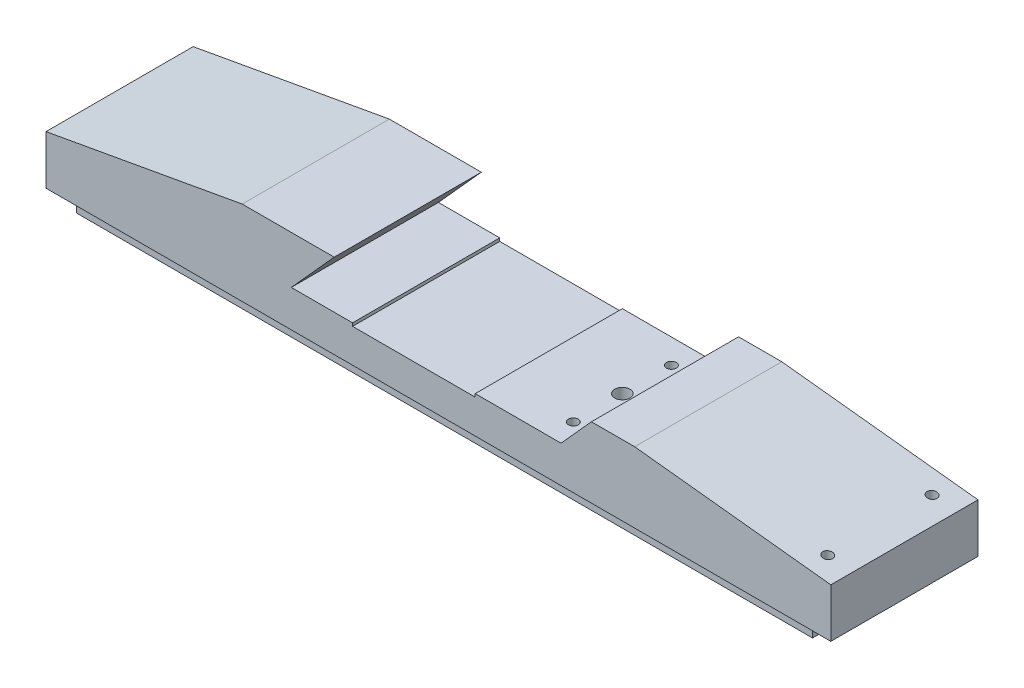
ISO-10303-21;
HEADER;
FILE_DESCRIPTION(('STEP AP214'),'2;1');
FILE_NAME('part.step','',(''),(''),'','','');
FILE_SCHEMA(('AUTOMOTIVE_DESIGN { 1 0 10303 214 1 1 1 1 }'));
ENDSEC;
DATA;
#1=APPLICATION_CONTEXT('core data for automotive mechanical design processes');
#2=APPLICATION_PROTOCOL_DEFINITION('international standard','automotive_design',2000,#1);
#3=PRODUCT_CONTEXT('',#1,'mechanical');
#4=PRODUCT('Part','Part','',(#3));
#5=PRODUCT_RELATED_PRODUCT_CATEGORY('part','',(#4));
#6=PRODUCT_DEFINITION_FORMATION('','',#4);
#7=PRODUCT_DEFINITION_CONTEXT('part definition',#1,'design');
#8=PRODUCT_DEFINITION('design','',#6,#7);
#9=PRODUCT_DEFINITION_SHAPE('','',#8);
#10=(LENGTH_UNIT() NAMED_UNIT(*) SI_UNIT(.MILLI.,.METRE.));
#11=(NAMED_UNIT(*) PLANE_ANGLE_UNIT() SI_UNIT($,.RADIAN.));
#12=(NAMED_UNIT(*) SI_UNIT($,.STERADIAN.) SOLID_ANGLE_UNIT());
#13=UNCERTAINTY_MEASURE_WITH_UNIT(LENGTH_MEASURE(1.E-05),#10,'distance_accuracy_value','');
#14=(GEOMETRIC_REPRESENTATION_CONTEXT(3) GLOBAL_UNCERTAINTY_ASSIGNED_CONTEXT((#13)) GLOBAL_UNIT_ASSIGNED_CONTEXT((#10,
#11,#12)) REPRESENTATION_CONTEXT('',''));
#15=CARTESIAN_POINT('',(0.,0.,0.));
#16=DIRECTION('',(0.,0.,1.));
#17=DIRECTION('',(1.,0.,0.));
#18=AXIS2_PLACEMENT_3D('',#15,#16,#17);
#19=CARTESIAN_POINT('',(406.4,0.,-76.2));
#20=DIRECTION('',(1.,0.,0.));
#21=DIRECTION('',(0.,0.,-1.));
#22=AXIS2_PLACEMENT_3D('',#19,#20,#21);
#23=PLANE('',#22);
#24=DIRECTION('',(0.,0.,1.));
#25=VECTOR('',#24,1.);
#26=CARTESIAN_POINT('',(406.4,19.1516,0.));
#27=LINE('',#26,#25);
#28=CARTESIAN_POINT('',(406.4,19.1516,-25.4381));
#29=VERTEX_POINT('',#28);
#30=CARTESIAN_POINT('',(406.4,19.1516,0.));
#31=VERTEX_POINT('',#30);
#32=EDGE_CURVE('E270',#29,#31,#27,.T.);
#33=ORIENTED_EDGE('',*,*,#32,.F.);
#34=DIRECTION('',(0.,1.,0.));
#35=VECTOR('',#34,1.);
#36=CARTESIAN_POINT('',(406.4,0.,-25.4381));
#37=LINE('',#36,#35);
#38=CARTESIAN_POINT('',(406.4,19.1262,-25.4381));
#39=VERTEX_POINT('',#38);
#40=EDGE_CURVE('E272',#39,#29,#37,.T.);
#41=ORIENTED_EDGE('',*,*,#40,.F.);
#42=DIRECTION('',(0.,0.,1.));
#43=VECTOR('',#42,1.);
#44=CARTESIAN_POINT('',(406.4,19.1262,-76.2));
#45=LINE('',#44,#43);
#46=CARTESIAN_POINT('',(406.4,19.1262,-50.7619));
#47=VERTEX_POINT('',#46);
#48=EDGE_CURVE('E327',#47,#39,#45,.T.);
#49=ORIENTED_EDGE('',*,*,#48,.F.);
#50=DIRECTION('',(0.,1.,0.));
#51=VECTOR('',#50,1.);
#52=CARTESIAN_POINT('',(406.4,0.,-50.7619));
#53=LINE('',#52,#51);
#54=CARTESIAN_POINT('',(406.4,19.1516,-50.7619));
#55=VERTEX_POINT('',#54);
#56=EDGE_CURVE('E76',#47,#55,#53,.T.);
#57=ORIENTED_EDGE('',*,*,#56,.T.);
#58=DIRECTION('',(0.,0.,-1.));
#59=VECTOR('',#58,1.);
#60=CARTESIAN_POINT('',(406.4,19.1516,0.));
#61=LINE('',#60,#59);
#62=CARTESIAN_POINT('',(406.4,19.1516,-76.2));
#63=VERTEX_POINT('',#62);
#64=EDGE_CURVE('E299',#55,#63,#61,.T.);
#65=ORIENTED_EDGE('',*,*,#64,.T.);
#66=DIRECTION('',(0.,1.,0.));
#67=VECTOR('',#66,1.);
#68=CARTESIAN_POINT('',(406.4,0.,-76.2));
#69=LINE('',#68,#67);
#70=CARTESIAN_POINT('',(406.4,44.5262,-76.2));
#71=VERTEX_POINT('',#70);
#72=EDGE_CURVE('E337',#63,#71,#69,.T.);
#73=ORIENTED_EDGE('',*,*,#72,.T.);
#74=DIRECTION('',(0.,0.,1.));
#75=VECTOR('',#74,1.);
#76=CARTESIAN_POINT('',(406.4,44.5262,-76.2));
#77=LINE('',#76,#75);
#78=CARTESIAN_POINT('',(406.4,44.5262,0.));
#79=VERTEX_POINT('',#78);
#80=EDGE_CURVE('E433',#71,#79,#77,.T.);
#81=ORIENTED_EDGE('',*,*,#80,.T.);
#82=DIRECTION('',(0.,1.,0.));
#83=VECTOR('',#82,1.);
#84=CARTESIAN_POINT('',(406.4,0.,0.));
#85=LINE('',#84,#83);
#86=EDGE_CURVE('E376',#31,#79,#85,.T.);
#87=ORIENTED_EDGE('',*,*,#86,.F.);
#88=EDGE_LOOP('',(#33,#41,#49,#57,#65,#73,#81,#87));
#89=FACE_BOUND('',#88,.T.);
#90=ADVANCED_FACE('F52',(#89),#23,.T.);
#91=CARTESIAN_POINT('',(0.,44.5516,-76.2));
#92=DIRECTION('',(-1.,0.,0.));
#93=DIRECTION('',(0.,-1.,0.));
#94=AXIS2_PLACEMENT_3D('',#91,#92,#93);
#95=PLANE('',#94);
#96=DIRECTION('',(0.,0.,1.));
#97=VECTOR('',#96,1.);
#98=CARTESIAN_POINT('',(0.,0.,-76.2));
#99=LINE('',#98,#97);
#100=CARTESIAN_POINT('',(0.,0.,-60.2869));
#101=VERTEX_POINT('',#100);
#102=CARTESIAN_POINT('',(0.,0.,-15.9131));
#103=VERTEX_POINT('',#102);
#104=EDGE_CURVE('E373',#101,#103,#99,.T.);
#105=ORIENTED_EDGE('',*,*,#104,.T.);
#106=DIRECTION('',(0.,1.,0.));
#107=VECTOR('',#106,1.);
#108=CARTESIAN_POINT('',(0.,-1.27859324435232E-13,-15.9131));
#109=LINE('',#108,#107);
#110=CARTESIAN_POINT('',(0.,9.5504,-15.9131));
#111=VERTEX_POINT('',#110);
#112=EDGE_CURVE('E269',#103,#111,#109,.T.);
#113=ORIENTED_EDGE('',*,*,#112,.T.);
#114=DIRECTION('',(0.,0.,-1.));
#115=VECTOR('',#114,1.);
#116=CARTESIAN_POINT('',(0.,9.5504,0.));
#117=LINE('',#116,#115);
#118=CARTESIAN_POINT('',(0.,9.5504,-25.4381));
#119=VERTEX_POINT('',#118);
#120=EDGE_CURVE('E273',#111,#119,#117,.T.);
#121=ORIENTED_EDGE('',*,*,#120,.T.);
#122=DIRECTION('',(0.,1.,0.));
#123=VECTOR('',#122,1.);
#124=CARTESIAN_POINT('',(0.,0.,-25.4381));
#125=LINE('',#124,#123);
#126=CARTESIAN_POINT('',(0.,19.1516,-25.4381));
#127=VERTEX_POINT('',#126);
#128=EDGE_CURVE('E281',#119,#127,#125,.T.);
#129=ORIENTED_EDGE('',*,*,#128,.T.);
#130=DIRECTION('',(0.,0.,1.));
#131=VECTOR('',#130,1.);
#132=CARTESIAN_POINT('',(0.,19.1516,0.));
#133=LINE('',#132,#131);
#134=CARTESIAN_POINT('',(0.,19.1516,0.));
#135=VERTEX_POINT('',#134);
#136=EDGE_CURVE('E278',#127,#135,#133,.T.);
#137=ORIENTED_EDGE('',*,*,#136,.T.);
#138=DIRECTION('',(0.,-1.,0.));
#139=VECTOR('',#138,1.);
#140=CARTESIAN_POINT('',(0.,44.5516,0.));
#141=LINE('',#140,#139);
#142=CARTESIAN_POINT('',(0.,44.5516,0.));
#143=VERTEX_POINT('',#142);
#144=EDGE_CURVE('E332',#143,#135,#141,.T.);
#145=ORIENTED_EDGE('',*,*,#144,.F.);
#146=DIRECTION('',(0.,0.,1.));
#147=VECTOR('',#146,1.);
#148=CARTESIAN_POINT('',(0.,44.5516,-76.2));
#149=LINE('',#148,#147);
#150=CARTESIAN_POINT('',(0.,44.5516,-76.2));
#151=VERTEX_POINT('',#150);
#152=EDGE_CURVE('E410',#151,#143,#149,.T.);
#153=ORIENTED_EDGE('',*,*,#152,.F.);
#154=DIRECTION('',(0.,-1.,0.));
#155=VECTOR('',#154,1.);
#156=CARTESIAN_POINT('',(0.,44.5516,-76.2));
#157=LINE('',#156,#155);
#158=CARTESIAN_POINT('',(0.,19.1516,-76.2));
#159=VERTEX_POINT('',#158);
#160=EDGE_CURVE('E334',#151,#159,#157,.T.);
#161=ORIENTED_EDGE('',*,*,#160,.T.);
#162=DIRECTION('',(0.,0.,-1.));
#163=VECTOR('',#162,1.);
#164=CARTESIAN_POINT('',(0.,19.1516,0.));
#165=LINE('',#164,#163);
#166=CARTESIAN_POINT('',(0.,19.1516,-50.7619));
#167=VERTEX_POINT('',#166);
#168=EDGE_CURVE('E300',#167,#159,#165,.T.);
#169=ORIENTED_EDGE('',*,*,#168,.F.);
#170=DIRECTION('',(0.,1.,0.));
#171=VECTOR('',#170,1.);
#172=CARTESIAN_POINT('',(0.,0.,-50.7619));
#173=LINE('',#172,#171);
#174=CARTESIAN_POINT('',(0.,9.5504,-50.7619));
#175=VERTEX_POINT('',#174);
#176=EDGE_CURVE('E309',#175,#167,#173,.T.);
#177=ORIENTED_EDGE('',*,*,#176,.F.);
#178=DIRECTION('',(0.,0.,1.));
#179=VECTOR('',#178,1.);
#180=CARTESIAN_POINT('',(0.,9.5504,0.));
#181=LINE('',#180,#179);
#182=CARTESIAN_POINT('',(0.,9.5504,-60.2869));
#183=VERTEX_POINT('',#182);
#184=EDGE_CURVE('E306',#183,#175,#181,.T.);
#185=ORIENTED_EDGE('',*,*,#184,.F.);
#186=DIRECTION('',(0.,1.,0.));
#187=VECTOR('',#186,1.);
#188=CARTESIAN_POINT('',(0.,0.,-60.2869));
#189=LINE('',#188,#187);
#190=EDGE_CURVE('E297',#101,#183,#189,.T.);
#191=ORIENTED_EDGE('',*,*,#190,.F.);
#192=EDGE_LOOP('',(#105,#113,#121,#129,#137,#145,#153,#161,#169,#177,#185,#191));
#193=FACE_BOUND('',#192,.T.);
#194=ADVANCED_FACE('F54',(#193),#95,.T.);
#195=CARTESIAN_POINT('',(0.,0.,-76.2));
#196=DIRECTION('',(0.,-1.,0.));
#197=DIRECTION('',(0.,0.,-1.));
#198=AXIS2_PLACEMENT_3D('',#195,#196,#197);
#199=PLANE('',#198);
#200=DIRECTION('',(0.,0.,-1.));
#201=VECTOR('',#200,1.);
#202=CARTESIAN_POINT('',(381.,0.,0.));
#203=LINE('',#202,#201);
#204=CARTESIAN_POINT('',(381.,0.,-15.9131));
#205=VERTEX_POINT('',#204);
#206=CARTESIAN_POINT('',(381.,0.,-60.2869));
#207=VERTEX_POINT('',#206);
#208=EDGE_CURVE('E326',#205,#207,#203,.T.);
#209=ORIENTED_EDGE('',*,*,#208,.F.);
#210=DIRECTION('',(-1.,0.,0.));
#211=VECTOR('',#210,1.);
#212=CARTESIAN_POINT('',(406.4,0.,-15.9131));
#213=LINE('',#212,#211);
#214=EDGE_CURVE('E275',#205,#103,#213,.T.);
#215=ORIENTED_EDGE('',*,*,#214,.T.);
#216=ORIENTED_EDGE('',*,*,#104,.F.);
#217=DIRECTION('',(-1.,0.,0.));
#218=VECTOR('',#217,1.);
#219=CARTESIAN_POINT('',(406.4,0.,-60.2869));
#220=LINE('',#219,#218);
#221=EDGE_CURVE('E303',#207,#101,#220,.T.);
#222=ORIENTED_EDGE('',*,*,#221,.F.);
#223=EDGE_LOOP('',(#209,#215,#216,#222));
#224=FACE_BOUND('',#223,.T.);
#225=ADVANCED_FACE('F476',(#224),#199,.T.);
#226=CARTESIAN_POINT('',(0.,0.,0.));
#227=DIRECTION('',(0.,0.,1.));
#228=DIRECTION('',(1.,0.,0.));
#229=AXIS2_PLACEMENT_3D('',#226,#227,#228);
#230=PLANE('',#229);
#231=ORIENTED_EDGE('',*,*,#144,.T.);
#232=DIRECTION('',(-1.,0.,0.));
#233=VECTOR('',#232,1.);
#234=CARTESIAN_POINT('',(406.4,19.1516,0.));
#235=LINE('',#234,#233);
#236=EDGE_CURVE('E292',#31,#135,#235,.T.);
#237=ORIENTED_EDGE('',*,*,#236,.F.);
#238=ORIENTED_EDGE('',*,*,#86,.T.);
#239=DIRECTION('',(-0.994071691754376,0.108726591285635,0.));
#240=VECTOR('',#239,1.);
#241=CARTESIAN_POINT('',(406.4,44.5262,0.));
#242=LINE('',#241,#240);
#243=CARTESIAN_POINT('',(304.8,55.6387,0.));
#244=VERTEX_POINT('',#243);
#245=EDGE_CURVE('E378',#79,#244,#242,.T.);
#246=ORIENTED_EDGE('',*,*,#245,.T.);
#247=DIRECTION('',(-1.,0.,0.));
#248=VECTOR('',#247,1.);
#249=CARTESIAN_POINT('',(304.8,55.6387,0.));
#250=LINE('',#249,#248);
#251=CARTESIAN_POINT('',(282.423305623551,55.6387,0.));
#252=VERTEX_POINT('',#251);
#253=EDGE_CURVE('E381',#244,#252,#250,.T.);
#254=ORIENTED_EDGE('',*,*,#253,.T.);
#255=DIRECTION('',(-0.669130606358857,-0.743144825477395,0.));
#256=VECTOR('',#255,1.);
#257=CARTESIAN_POINT('',(282.423305623551,55.6387,0.));
#258=LINE('',#257,#256);
#259=CARTESIAN_POINT('',(266.7,38.1762,0.));
#260=VERTEX_POINT('',#259);
#261=EDGE_CURVE('E384',#252,#260,#258,.T.);
#262=ORIENTED_EDGE('',*,*,#261,.T.);
#263=DIRECTION('',(-1.,0.,0.));
#264=VECTOR('',#263,1.);
#265=CARTESIAN_POINT('',(266.7,38.1762,0.));
#266=LINE('',#265,#264);
#267=CARTESIAN_POINT('',(222.25,38.1762,0.));
#268=VERTEX_POINT('',#267);
#269=EDGE_CURVE('E387',#260,#268,#266,.T.);
#270=ORIENTED_EDGE('',*,*,#269,.T.);
#271=DIRECTION('',(0.,-1.,0.));
#272=VECTOR('',#271,1.);
#273=CARTESIAN_POINT('',(222.25,38.1762,0.));
#274=LINE('',#273,#272);
#275=CARTESIAN_POINT('',(222.25,36.5887,0.));
#276=VERTEX_POINT('',#275);
#277=EDGE_CURVE('E390',#268,#276,#274,.T.);
#278=ORIENTED_EDGE('',*,*,#277,.T.);
#279=DIRECTION('',(-1.,0.,0.));
#280=VECTOR('',#279,1.);
#281=CARTESIAN_POINT('',(222.25,36.5887,0.));
#282=LINE('',#281,#280);
#283=CARTESIAN_POINT('',(158.75,36.5887,0.));
#284=VERTEX_POINT('',#283);
#285=EDGE_CURVE('E393',#276,#284,#282,.T.);
#286=ORIENTED_EDGE('',*,*,#285,.T.);
#287=DIRECTION('',(0.,1.,0.));
#288=VECTOR('',#287,1.);
#289=CARTESIAN_POINT('',(158.75,36.5887,0.));
#290=LINE('',#289,#288);
#291=CARTESIAN_POINT('',(158.75,38.1762,0.));
#292=VERTEX_POINT('',#291);
#293=EDGE_CURVE('E396',#284,#292,#290,.T.);
#294=ORIENTED_EDGE('',*,*,#293,.T.);
#295=DIRECTION('',(-1.,0.,0.));
#296=VECTOR('',#295,1.);
#297=CARTESIAN_POINT('',(158.75,38.1762,0.));
#298=LINE('',#297,#296);
#299=CARTESIAN_POINT('',(127.,38.1762,0.));
#300=VERTEX_POINT('',#299);
#301=EDGE_CURVE('E399',#292,#300,#298,.T.);
#302=ORIENTED_EDGE('',*,*,#301,.T.);
#303=DIRECTION('',(0.669130606358862,0.743144825477391,0.));
#304=VECTOR('',#303,1.);
#305=CARTESIAN_POINT('',(127.,38.1762,0.));
#306=LINE('',#305,#304);
#307=CARTESIAN_POINT('',(149.225,62.8595631420786,0.));
#308=VERTEX_POINT('',#307);
#309=EDGE_CURVE('E402',#300,#308,#306,.T.);
#310=ORIENTED_EDGE('',*,*,#309,.T.);
#311=DIRECTION('',(-1.,0.,0.));
#312=VECTOR('',#311,1.);
#313=CARTESIAN_POINT('',(149.225,62.8595631420786,0.));
#314=LINE('',#313,#312);
#315=CARTESIAN_POINT('',(101.6,62.8595631420785,0.));
#316=VERTEX_POINT('',#315);
#317=EDGE_CURVE('E405',#308,#316,#314,.T.);
#318=ORIENTED_EDGE('',*,*,#317,.T.);
#319=DIRECTION('',(-0.984149591332616,-0.177340299649697,0.));
#320=VECTOR('',#319,1.);
#321=CARTESIAN_POINT('',(101.6,62.8595631420785,0.));
#322=LINE('',#321,#320);
#323=EDGE_CURVE('E338',#316,#143,#322,.T.);
#324=ORIENTED_EDGE('',*,*,#323,.T.);
#325=EDGE_LOOP('',(#231,#237,#238,#246,#254,#262,#270,#278,#286,#294,#302,#310,#318,#324));
#326=FACE_BOUND('',#325,.T.);
#327=ADVANCED_FACE('F494',(#326),#230,.T.);
#328=CARTESIAN_POINT('',(381.,19.1262,0.));
#329=DIRECTION('',(-1.,0.,0.));
#330=DIRECTION('',(0.,0.,1.));
#331=AXIS2_PLACEMENT_3D('',#328,#329,#330);
#332=PLANE('',#331);
#333=DIRECTION('',(0.,1.,0.));
#334=VECTOR('',#333,1.);
#335=CARTESIAN_POINT('',(381.,19.1261999999999,-15.9131000000002));
#336=LINE('',#335,#334);
#337=CARTESIAN_POINT('',(381.,9.55040000000001,-15.9131));
#338=VERTEX_POINT('',#337);
#339=EDGE_CURVE('E13',#205,#338,#336,.T.);
#340=ORIENTED_EDGE('',*,*,#339,.F.);
#341=ORIENTED_EDGE('',*,*,#208,.T.);
#342=DIRECTION('',(0.,1.,0.));
#343=VECTOR('',#342,1.);
#344=CARTESIAN_POINT('',(381.,19.1262,-60.2869));
#345=LINE('',#344,#343);
#346=CARTESIAN_POINT('',(381.,9.55040000000001,-60.2869));
#347=VERTEX_POINT('',#346);
#348=EDGE_CURVE('E439',#207,#347,#345,.T.);
#349=ORIENTED_EDGE('',*,*,#348,.T.);
#350=DIRECTION('',(0.,0.,1.));
#351=VECTOR('',#350,1.);
#352=CARTESIAN_POINT('',(381.,9.55040000000001,0.));
#353=LINE('',#352,#351);
#354=CARTESIAN_POINT('',(381.,9.55040000000001,-50.7619));
#355=VERTEX_POINT('',#354);
#356=EDGE_CURVE('E442',#347,#355,#353,.T.);
#357=ORIENTED_EDGE('',*,*,#356,.T.);
#358=DIRECTION('',(0.,1.,0.));
#359=VECTOR('',#358,1.);
#360=CARTESIAN_POINT('',(381.,19.1262,-50.7619));
#361=LINE('',#360,#359);
#362=CARTESIAN_POINT('',(381.,19.1262,-50.7619));
#363=VERTEX_POINT('',#362);
#364=EDGE_CURVE('E316',#355,#363,#361,.T.);
#365=ORIENTED_EDGE('',*,*,#364,.T.);
#366=DIRECTION('',(0.,0.,-1.));
#367=VECTOR('',#366,1.);
#368=CARTESIAN_POINT('',(381.,19.1262,0.));
#369=LINE('',#368,#367);
#370=CARTESIAN_POINT('',(381.,19.1262,-25.4381));
#371=VERTEX_POINT('',#370);
#372=EDGE_CURVE('E330',#371,#363,#369,.T.);
#373=ORIENTED_EDGE('',*,*,#372,.F.);
#374=DIRECTION('',(0.,1.,0.));
#375=VECTOR('',#374,1.);
#376=CARTESIAN_POINT('',(381.,19.1262,-25.4381));
#377=LINE('',#376,#375);
#378=CARTESIAN_POINT('',(381.,9.55040000000001,-25.4381));
#379=VERTEX_POINT('',#378);
#380=EDGE_CURVE('E68',#379,#371,#377,.T.);
#381=ORIENTED_EDGE('',*,*,#380,.F.);
#382=DIRECTION('',(0.,0.,-1.));
#383=VECTOR('',#382,1.);
#384=CARTESIAN_POINT('',(381.,9.55040000000001,0.));
#385=LINE('',#384,#383);
#386=EDGE_CURVE('E61',#338,#379,#385,.T.);
#387=ORIENTED_EDGE('',*,*,#386,.F.);
#388=EDGE_LOOP('',(#340,#341,#349,#357,#365,#373,#381,#387));
#389=FACE_BOUND('',#388,.T.);
#390=ADVANCED_FACE('F457',(#389),#332,.F.);
#391=CARTESIAN_POINT('',(0.,19.1262,0.));
#392=DIRECTION('',(0.,-1.,0.));
#393=DIRECTION('',(0.,0.,-1.));
#394=AXIS2_PLACEMENT_3D('',#391,#392,#393);
#395=PLANE('',#394);
#396=ORIENTED_EDGE('',*,*,#48,.T.);
#397=DIRECTION('',(-1.,0.,0.));
#398=VECTOR('',#397,1.);
#399=CARTESIAN_POINT('',(0.,19.1262,-25.4381));
#400=LINE('',#399,#398);
#401=EDGE_CURVE('E445',#39,#371,#400,.T.);
#402=ORIENTED_EDGE('',*,*,#401,.T.);
#403=ORIENTED_EDGE('',*,*,#372,.T.);
#404=DIRECTION('',(-1.,0.,0.));
#405=VECTOR('',#404,1.);
#406=CARTESIAN_POINT('',(0.,19.1262,-50.7619));
#407=LINE('',#406,#405);
#408=EDGE_CURVE('E412',#47,#363,#407,.T.);
#409=ORIENTED_EDGE('',*,*,#408,.F.);
#410=EDGE_LOOP('',(#396,#402,#403,#409));
#411=FACE_BOUND('',#410,.T.);
#412=ADVANCED_FACE('F459',(#411),#395,.T.);
#413=CARTESIAN_POINT('',(101.6,62.8595631420785,-76.2));
#414=DIRECTION('',(-0.177340299649697,0.984149591332616,0.));
#415=DIRECTION('',(-0.984149591332616,-0.177340299649697,0.));
#416=AXIS2_PLACEMENT_3D('',#413,#414,#415);
#417=PLANE('',#416);
#418=ORIENTED_EDGE('',*,*,#323,.F.);
#419=DIRECTION('',(0.,0.,1.));
#420=VECTOR('',#419,1.);
#421=CARTESIAN_POINT('',(101.6,62.8595631420785,-76.2));
#422=LINE('',#421,#420);
#423=CARTESIAN_POINT('',(101.6,62.8595631420785,-76.2));
#424=VERTEX_POINT('',#423);
#425=EDGE_CURVE('E413',#424,#316,#422,.T.);
#426=ORIENTED_EDGE('',*,*,#425,.F.);
#427=DIRECTION('',(-0.984149591332616,-0.177340299649697,0.));
#428=VECTOR('',#427,1.);
#429=CARTESIAN_POINT('',(101.6,62.8595631420785,-76.2));
#430=LINE('',#429,#428);
#431=EDGE_CURVE('E370',#424,#151,#430,.T.);
#432=ORIENTED_EDGE('',*,*,#431,.T.);
#433=ORIENTED_EDGE('',*,*,#152,.T.);
#434=EDGE_LOOP('',(#418,#426,#432,#433));
#435=FACE_BOUND('',#434,.T.);
#436=ADVANCED_FACE('F498',(#435),#417,.T.);
#437=CARTESIAN_POINT('',(149.225,62.8595631420786,-76.2));
#438=DIRECTION('',(0.,1.,0.));
#439=DIRECTION('',(-1.,0.,0.));
#440=AXIS2_PLACEMENT_3D('',#437,#438,#439);
#441=PLANE('',#440);
#442=ORIENTED_EDGE('',*,*,#317,.F.);
#443=DIRECTION('',(0.,0.,1.));
#444=VECTOR('',#443,1.);
#445=CARTESIAN_POINT('',(149.225,62.8595631420786,-76.2));
#446=LINE('',#445,#444);
#447=CARTESIAN_POINT('',(149.225,62.8595631420786,-76.2));
#448=VERTEX_POINT('',#447);
#449=EDGE_CURVE('E415',#448,#308,#446,.T.);
#450=ORIENTED_EDGE('',*,*,#449,.F.);
#451=DIRECTION('',(-1.,0.,0.));
#452=VECTOR('',#451,1.);
#453=CARTESIAN_POINT('',(149.225,62.8595631420786,-76.2));
#454=LINE('',#453,#452);
#455=EDGE_CURVE('E367',#448,#424,#454,.T.);
#456=ORIENTED_EDGE('',*,*,#455,.T.);
#457=ORIENTED_EDGE('',*,*,#425,.T.);
#458=EDGE_LOOP('',(#442,#450,#456,#457));
#459=FACE_BOUND('',#458,.T.);
#460=ADVANCED_FACE('F542',(#459),#441,.T.);
#461=CARTESIAN_POINT('',(127.,38.1762,-76.2));
#462=DIRECTION('',(0.743144825477391,-0.669130606358862,0.));
#463=DIRECTION('',(0.669130606358862,0.743144825477391,0.));
#464=AXIS2_PLACEMENT_3D('',#461,#462,#463);
#465=PLANE('',#464);
#466=ORIENTED_EDGE('',*,*,#309,.F.);
#467=DIRECTION('',(0.,0.,1.));
#468=VECTOR('',#467,1.);
#469=CARTESIAN_POINT('',(127.,38.1762,-76.2));
#470=LINE('',#469,#468);
#471=CARTESIAN_POINT('',(127.,38.1762,-76.2));
#472=VERTEX_POINT('',#471);
#473=EDGE_CURVE('E417',#472,#300,#470,.T.);
#474=ORIENTED_EDGE('',*,*,#473,.F.);
#475=DIRECTION('',(0.669130606358862,0.743144825477391,0.));
#476=VECTOR('',#475,1.);
#477=CARTESIAN_POINT('',(127.,38.1762,-76.2));
#478=LINE('',#477,#476);
#479=EDGE_CURVE('E364',#472,#448,#478,.T.);
#480=ORIENTED_EDGE('',*,*,#479,.T.);
#481=ORIENTED_EDGE('',*,*,#449,.T.);
#482=EDGE_LOOP('',(#466,#474,#480,#481));
#483=FACE_BOUND('',#482,.T.);
#484=ADVANCED_FACE('F540',(#483),#465,.T.);
#485=CARTESIAN_POINT('',(158.75,38.1762,-76.2));
#486=DIRECTION('',(0.,1.,0.));
#487=DIRECTION('',(0.,0.,1.));
#488=AXIS2_PLACEMENT_3D('',#485,#486,#487);
#489=PLANE('',#488);
#490=ORIENTED_EDGE('',*,*,#301,.F.);
#491=DIRECTION('',(0.,0.,1.));
#492=VECTOR('',#491,1.);
#493=CARTESIAN_POINT('',(158.75,38.1762,-76.2));
#494=LINE('',#493,#492);
#495=CARTESIAN_POINT('',(158.75,38.1762,-76.2));
#496=VERTEX_POINT('',#495);
#497=EDGE_CURVE('E419',#496,#292,#494,.T.);
#498=ORIENTED_EDGE('',*,*,#497,.F.);
#499=DIRECTION('',(-1.,0.,0.));
#500=VECTOR('',#499,1.);
#501=CARTESIAN_POINT('',(158.75,38.1762,-76.2));
#502=LINE('',#501,#500);
#503=EDGE_CURVE('E361',#496,#472,#502,.T.);
#504=ORIENTED_EDGE('',*,*,#503,.T.);
#505=ORIENTED_EDGE('',*,*,#473,.T.);
#506=EDGE_LOOP('',(#490,#498,#504,#505));
#507=FACE_BOUND('',#506,.T.);
#508=ADVANCED_FACE('F536',(#507),#489,.T.);
#509=CARTESIAN_POINT('',(158.75,36.5887,-76.2));
#510=DIRECTION('',(1.,0.,0.));
#511=DIRECTION('',(0.,0.,-1.));
#512=AXIS2_PLACEMENT_3D('',#509,#510,#511);
#513=PLANE('',#512);
#514=ORIENTED_EDGE('',*,*,#293,.F.);
#515=DIRECTION('',(0.,0.,1.));
#516=VECTOR('',#515,1.);
#517=CARTESIAN_POINT('',(158.75,36.5887,-76.2));
#518=LINE('',#517,#516);
#519=CARTESIAN_POINT('',(158.75,36.5887,-76.2));
#520=VERTEX_POINT('',#519);
#521=EDGE_CURVE('E421',#520,#284,#518,.T.);
#522=ORIENTED_EDGE('',*,*,#521,.F.);
#523=DIRECTION('',(0.,1.,0.));
#524=VECTOR('',#523,1.);
#525=CARTESIAN_POINT('',(158.75,36.5887,-76.2));
#526=LINE('',#525,#524);
#527=EDGE_CURVE('E358',#520,#496,#526,.T.);
#528=ORIENTED_EDGE('',*,*,#527,.T.);
#529=ORIENTED_EDGE('',*,*,#497,.T.);
#530=EDGE_LOOP('',(#514,#522,#528,#529));
#531=FACE_BOUND('',#530,.T.);
#532=ADVANCED_FACE('F532',(#531),#513,.T.);
#533=CARTESIAN_POINT('',(222.25,36.5887,-76.2));
#534=DIRECTION('',(0.,1.,0.));
#535=DIRECTION('',(-1.,0.,0.));
#536=AXIS2_PLACEMENT_3D('',#533,#534,#535);
#537=PLANE('',#536);
#538=ORIENTED_EDGE('',*,*,#285,.F.);
#539=DIRECTION('',(0.,0.,1.));
#540=VECTOR('',#539,1.);
#541=CARTESIAN_POINT('',(222.25,36.5887,-76.2));
#542=LINE('',#541,#540);
#543=CARTESIAN_POINT('',(222.25,36.5887,-76.2));
#544=VERTEX_POINT('',#543);
#545=EDGE_CURVE('E423',#544,#276,#542,.T.);
#546=ORIENTED_EDGE('',*,*,#545,.F.);
#547=DIRECTION('',(-1.,0.,0.));
#548=VECTOR('',#547,1.);
#549=CARTESIAN_POINT('',(222.25,36.5887,-76.2));
#550=LINE('',#549,#548);
#551=EDGE_CURVE('E355',#544,#520,#550,.T.);
#552=ORIENTED_EDGE('',*,*,#551,.T.);
#553=ORIENTED_EDGE('',*,*,#521,.T.);
#554=EDGE_LOOP('',(#538,#546,#552,#553));
#555=FACE_BOUND('',#554,.T.);
#556=ADVANCED_FACE('F528',(#555),#537,.T.);
#557=CARTESIAN_POINT('',(222.25,38.1762,-76.2));
#558=DIRECTION('',(-1.,0.,0.));
#559=DIRECTION('',(0.,0.,1.));
#560=AXIS2_PLACEMENT_3D('',#557,#558,#559);
#561=PLANE('',#560);
#562=ORIENTED_EDGE('',*,*,#277,.F.);
#563=DIRECTION('',(0.,0.,1.));
#564=VECTOR('',#563,1.);
#565=CARTESIAN_POINT('',(222.25,38.1762,-76.2));
#566=LINE('',#565,#564);
#567=CARTESIAN_POINT('',(222.25,38.1762,-76.2));
#568=VERTEX_POINT('',#567);
#569=EDGE_CURVE('E425',#568,#268,#566,.T.);
#570=ORIENTED_EDGE('',*,*,#569,.F.);
#571=DIRECTION('',(0.,-1.,0.));
#572=VECTOR('',#571,1.);
#573=CARTESIAN_POINT('',(222.25,38.1762,-76.2));
#574=LINE('',#573,#572);
#575=EDGE_CURVE('E352',#568,#544,#574,.T.);
#576=ORIENTED_EDGE('',*,*,#575,.T.);
#577=ORIENTED_EDGE('',*,*,#545,.T.);
#578=EDGE_LOOP('',(#562,#570,#576,#577));
#579=FACE_BOUND('',#578,.T.);
#580=ADVANCED_FACE('F524',(#579),#561,.T.);
#581=CARTESIAN_POINT('',(266.7,38.1762,-76.2));
#582=DIRECTION('',(0.,1.,0.));
#583=DIRECTION('',(-1.,0.,0.));
#584=AXIS2_PLACEMENT_3D('',#581,#582,#583);
#585=PLANE('',#584);
#586=CARTESIAN_POINT('',(260.35,38.1762,-63.5));
#587=DIRECTION('',(0.,1.,0.));
#588=DIRECTION('',(0.,0.,1.));
#589=AXIS2_PLACEMENT_3D('',#586,#587,#588);
#590=CIRCLE('',#589,2.55270000000002);
#591=CARTESIAN_POINT('',(260.35,38.1762,-60.9473));
#592=VERTEX_POINT('',#591);
#593=EDGE_CURVE('E239',#592,#592,#590,.T.);
#594=ORIENTED_EDGE('',*,*,#593,.F.);
#595=EDGE_LOOP('',(#594));
#596=FACE_BOUND('',#595,.T.);
#597=CARTESIAN_POINT('',(260.35,38.1762,-12.7));
#598=DIRECTION('',(0.,1.,0.));
#599=DIRECTION('',(0.,0.,1.));
#600=AXIS2_PLACEMENT_3D('',#597,#598,#599);
#601=CIRCLE('',#600,2.55270000000002);
#602=CARTESIAN_POINT('',(260.35,38.1762,-10.1473));
#603=VERTEX_POINT('',#602);
#604=EDGE_CURVE('E238',#603,#603,#601,.T.);
#605=ORIENTED_EDGE('',*,*,#604,.F.);
#606=EDGE_LOOP('',(#605));
#607=FACE_BOUND('',#606,.T.);
#608=CARTESIAN_POINT('',(260.35,38.1762,-38.1));
#609=DIRECTION('',(0.,1.,0.));
#610=DIRECTION('',(0.,0.,1.));
#611=AXIS2_PLACEMENT_3D('',#608,#609,#610);
#612=CIRCLE('',#611,3.96875000000002);
#613=CARTESIAN_POINT('',(260.35,38.1762,-34.13125));
#614=VERTEX_POINT('',#613);
#615=EDGE_CURVE('E251',#614,#614,#612,.T.);
#616=ORIENTED_EDGE('',*,*,#615,.F.);
#617=EDGE_LOOP('',(#616));
#618=FACE_BOUND('',#617,.T.);
#619=ORIENTED_EDGE('',*,*,#269,.F.);
#620=DIRECTION('',(0.,0.,1.));
#621=VECTOR('',#620,1.);
#622=CARTESIAN_POINT('',(266.7,38.1762,-76.2));
#623=LINE('',#622,#621);
#624=CARTESIAN_POINT('',(266.7,38.1762,-76.2));
#625=VERTEX_POINT('',#624);
#626=EDGE_CURVE('E427',#625,#260,#623,.T.);
#627=ORIENTED_EDGE('',*,*,#626,.F.);
#628=DIRECTION('',(-1.,0.,0.));
#629=VECTOR('',#628,1.);
#630=CARTESIAN_POINT('',(266.7,38.1762,-76.2));
#631=LINE('',#630,#629);
#632=EDGE_CURVE('E349',#625,#568,#631,.T.);
#633=ORIENTED_EDGE('',*,*,#632,.T.);
#634=ORIENTED_EDGE('',*,*,#569,.T.);
#635=EDGE_LOOP('',(#619,#627,#633,#634));
#636=FACE_BOUND('',#635,.T.);
#637=ADVANCED_FACE('F520',(#596,#607,#618,#636),#585,.T.);
#638=CARTESIAN_POINT('',(282.423305623551,55.6387,-76.2));
#639=DIRECTION('',(-0.743144825477395,0.669130606358857,0.));
#640=DIRECTION('',(-0.669130606358857,-0.743144825477395,0.));
#641=AXIS2_PLACEMENT_3D('',#638,#639,#640);
#642=PLANE('',#641);
#643=ORIENTED_EDGE('',*,*,#261,.F.);
#644=DIRECTION('',(0.,0.,1.));
#645=VECTOR('',#644,1.);
#646=CARTESIAN_POINT('',(282.423305623551,55.6387,-76.2));
#647=LINE('',#646,#645);
#648=CARTESIAN_POINT('',(282.423305623551,55.6387,-76.2));
#649=VERTEX_POINT('',#648);
#650=EDGE_CURVE('E429',#649,#252,#647,.T.);
#651=ORIENTED_EDGE('',*,*,#650,.F.);
#652=DIRECTION('',(-0.669130606358857,-0.743144825477395,0.));
#653=VECTOR('',#652,1.);
#654=CARTESIAN_POINT('',(282.423305623551,55.6387,-76.2));
#655=LINE('',#654,#653);
#656=EDGE_CURVE('E346',#649,#625,#655,.T.);
#657=ORIENTED_EDGE('',*,*,#656,.T.);
#658=ORIENTED_EDGE('',*,*,#626,.T.);
#659=EDGE_LOOP('',(#643,#651,#657,#658));
#660=FACE_BOUND('',#659,.T.);
#661=ADVANCED_FACE('F516',(#660),#642,.T.);
#662=CARTESIAN_POINT('',(304.8,55.6387,-76.2));
#663=DIRECTION('',(0.,1.,0.));
#664=DIRECTION('',(0.,0.,1.));
#665=AXIS2_PLACEMENT_3D('',#662,#663,#664);
#666=PLANE('',#665);
#667=ORIENTED_EDGE('',*,*,#253,.F.);
#668=DIRECTION('',(0.,0.,1.));
#669=VECTOR('',#668,1.);
#670=CARTESIAN_POINT('',(304.8,55.6387,-76.2));
#671=LINE('',#670,#669);
#672=CARTESIAN_POINT('',(304.8,55.6387,-76.2));
#673=VERTEX_POINT('',#672);
#674=EDGE_CURVE('E431',#673,#244,#671,.T.);
#675=ORIENTED_EDGE('',*,*,#674,.F.);
#676=DIRECTION('',(-1.,0.,0.));
#677=VECTOR('',#676,1.);
#678=CARTESIAN_POINT('',(304.8,55.6387,-76.2));
#679=LINE('',#678,#677);
#680=EDGE_CURVE('E343',#673,#649,#679,.T.);
#681=ORIENTED_EDGE('',*,*,#680,.T.);
#682=ORIENTED_EDGE('',*,*,#650,.T.);
#683=EDGE_LOOP('',(#667,#675,#681,#682));
#684=FACE_BOUND('',#683,.T.);
#685=ADVANCED_FACE('F513',(#684),#666,.T.);
#686=CARTESIAN_POINT('',(406.4,44.5262,-76.2));
#687=DIRECTION('',(0.108726591285635,0.994071691754376,0.));
#688=DIRECTION('',(-0.994071691754376,0.108726591285635,0.));
#689=AXIS2_PLACEMENT_3D('',#686,#687,#688);
#690=PLANE('',#689);
#691=CARTESIAN_POINT('',(393.7,45.9152625,-11.1125));
#692=DIRECTION('',(0.108726591285635,0.994071691754376,0.));
#693=DIRECTION('',(0.994071691754376,-0.108726591285635,0.));
#694=AXIS2_PLACEMENT_3D('',#691,#692,#693);
#695=ELLIPSE('',#694,2.56792344171363,2.55269999999999);
#696=CARTESIAN_POINT('',(396.2527,45.6360609375,-11.1125));
#697=VERTEX_POINT('',#696);
#698=EDGE_CURVE('E56',#697,#697,#695,.T.);
#699=ORIENTED_EDGE('',*,*,#698,.F.);
#700=EDGE_LOOP('',(#699));
#701=FACE_BOUND('',#700,.T.);
#702=CARTESIAN_POINT('',(393.7,45.9152625,-65.0875));
#703=DIRECTION('',(0.108726591285635,0.994071691754376,0.));
#704=DIRECTION('',(0.994071691754376,-0.108726591285635,0.));
#705=AXIS2_PLACEMENT_3D('',#702,#703,#704);
#706=ELLIPSE('',#705,2.56792344171363,2.55269999999999);
#707=CARTESIAN_POINT('',(396.2527,45.6360609375,-65.0875));
#708=VERTEX_POINT('',#707);
#709=EDGE_CURVE('E245',#708,#708,#706,.T.);
#710=ORIENTED_EDGE('',*,*,#709,.F.);
#711=EDGE_LOOP('',(#710));
#712=FACE_BOUND('',#711,.T.);
#713=ORIENTED_EDGE('',*,*,#245,.F.);
#714=ORIENTED_EDGE('',*,*,#80,.F.);
#715=DIRECTION('',(-0.994071691754376,0.108726591285635,0.));
#716=VECTOR('',#715,1.);
#717=CARTESIAN_POINT('',(406.4,44.5262,-76.2));
#718=LINE('',#717,#716);
#719=EDGE_CURVE('E340',#71,#673,#718,.T.);
#720=ORIENTED_EDGE('',*,*,#719,.T.);
#721=ORIENTED_EDGE('',*,*,#674,.T.);
#722=EDGE_LOOP('',(#713,#714,#720,#721));
#723=FACE_BOUND('',#722,.T.);
#724=ADVANCED_FACE('F509',(#701,#712,#723),#690,.T.);
#725=CARTESIAN_POINT('',(0.,0.,-76.2));
#726=DIRECTION('',(0.,0.,1.));
#727=DIRECTION('',(1.,0.,0.));
#728=AXIS2_PLACEMENT_3D('',#725,#726,#727);
#729=PLANE('',#728);
#730=CARTESIAN_POINT('',(149.225,28.6512,-76.2));
#731=DIRECTION('',(0.,0.,-1.));
#732=DIRECTION('',(-1.,0.,0.));
#733=AXIS2_PLACEMENT_3D('',#730,#731,#732);
#734=CIRCLE('',#733,2.55269999999999);
#735=CARTESIAN_POINT('',(146.6723,28.6512,-76.2));
#736=VERTEX_POINT('',#735);
#737=EDGE_CURVE('E257',#736,#736,#734,.T.);
#738=ORIENTED_EDGE('',*,*,#737,.F.);
#739=EDGE_LOOP('',(#738));
#740=FACE_BOUND('',#739,.T.);
#741=CARTESIAN_POINT('',(231.775,28.6512,-76.2));
#742=DIRECTION('',(0.,0.,-1.));
#743=DIRECTION('',(-1.,0.,0.));
#744=AXIS2_PLACEMENT_3D('',#741,#742,#743);
#745=CIRCLE('',#744,2.55269999999999);
#746=CARTESIAN_POINT('',(229.2223,28.6512,-76.2));
#747=VERTEX_POINT('',#746);
#748=EDGE_CURVE('E263',#747,#747,#745,.T.);
#749=ORIENTED_EDGE('',*,*,#748,.F.);
#750=EDGE_LOOP('',(#749));
#751=FACE_BOUND('',#750,.T.);
#752=ORIENTED_EDGE('',*,*,#72,.F.);
#753=DIRECTION('',(-1.,0.,0.));
#754=VECTOR('',#753,1.);
#755=CARTESIAN_POINT('',(406.4,19.1516,-76.2));
#756=LINE('',#755,#754);
#757=EDGE_CURVE('E313',#63,#159,#756,.T.);
#758=ORIENTED_EDGE('',*,*,#757,.T.);
#759=ORIENTED_EDGE('',*,*,#160,.F.);
#760=ORIENTED_EDGE('',*,*,#431,.F.);
#761=ORIENTED_EDGE('',*,*,#455,.F.);
#762=ORIENTED_EDGE('',*,*,#479,.F.);
#763=ORIENTED_EDGE('',*,*,#503,.F.);
#764=ORIENTED_EDGE('',*,*,#527,.F.);
#765=ORIENTED_EDGE('',*,*,#551,.F.);
#766=ORIENTED_EDGE('',*,*,#575,.F.);
#767=ORIENTED_EDGE('',*,*,#632,.F.);
#768=ORIENTED_EDGE('',*,*,#656,.F.);
#769=ORIENTED_EDGE('',*,*,#680,.F.);
#770=ORIENTED_EDGE('',*,*,#719,.F.);
#771=EDGE_LOOP('',(#752,#758,#759,#760,#761,#762,#763,#764,#765,#766,#767,#768,#769,#770));
#772=FACE_BOUND('',#771,.T.);
#773=ADVANCED_FACE('F502',(#740,#751,#772),#729,.F.);
#774=CARTESIAN_POINT('',(406.4,9.55040000000002,0.));
#775=DIRECTION('',(0.,-1.,0.));
#776=DIRECTION('',(1.,0.,0.));
#777=AXIS2_PLACEMENT_3D('',#774,#775,#776);
#778=PLANE('',#777);
#779=DIRECTION('',(-1.,0.,0.));
#780=VECTOR('',#779,1.);
#781=CARTESIAN_POINT('',(406.4,9.55040000000002,-60.2869));
#782=LINE('',#781,#780);
#783=EDGE_CURVE('E321',#347,#183,#782,.T.);
#784=ORIENTED_EDGE('',*,*,#783,.T.);
#785=ORIENTED_EDGE('',*,*,#184,.T.);
#786=DIRECTION('',(-1.,0.,0.));
#787=VECTOR('',#786,1.);
#788=CARTESIAN_POINT('',(406.4,9.55040000000002,-50.7619));
#789=LINE('',#788,#787);
#790=EDGE_CURVE('E319',#355,#175,#789,.T.);
#791=ORIENTED_EDGE('',*,*,#790,.F.);
#792=ORIENTED_EDGE('',*,*,#356,.F.);
#793=EDGE_LOOP('',(#784,#785,#791,#792));
#794=FACE_BOUND('',#793,.T.);
#795=ADVANCED_FACE('F464',(#794),#778,.F.);
#796=CARTESIAN_POINT('',(406.4,0.,-60.2869));
#797=DIRECTION('',(0.,0.,1.));
#798=DIRECTION('',(1.,0.,0.));
#799=AXIS2_PLACEMENT_3D('',#796,#797,#798);
#800=PLANE('',#799);
#801=ORIENTED_EDGE('',*,*,#221,.T.);
#802=ORIENTED_EDGE('',*,*,#190,.T.);
#803=ORIENTED_EDGE('',*,*,#783,.F.);
#804=ORIENTED_EDGE('',*,*,#348,.F.);
#805=EDGE_LOOP('',(#801,#802,#803,#804));
#806=FACE_BOUND('',#805,.T.);
#807=ADVANCED_FACE('F472',(#806),#800,.F.);
#808=CARTESIAN_POINT('',(406.4,0.,-50.7619));
#809=DIRECTION('',(0.,0.,1.));
#810=DIRECTION('',(1.,0.,0.));
#811=AXIS2_PLACEMENT_3D('',#808,#809,#810);
#812=PLANE('',#811);
#813=ORIENTED_EDGE('',*,*,#790,.T.);
#814=ORIENTED_EDGE('',*,*,#176,.T.);
#815=DIRECTION('',(-1.,0.,0.));
#816=VECTOR('',#815,1.);
#817=CARTESIAN_POINT('',(406.4,19.1516,-50.7619));
#818=LINE('',#817,#816);
#819=EDGE_CURVE('E317',#55,#167,#818,.T.);
#820=ORIENTED_EDGE('',*,*,#819,.F.);
#821=ORIENTED_EDGE('',*,*,#56,.F.);
#822=ORIENTED_EDGE('',*,*,#408,.T.);
#823=ORIENTED_EDGE('',*,*,#364,.F.);
#824=EDGE_LOOP('',(#813,#814,#820,#821,#822,#823));
#825=FACE_BOUND('',#824,.T.);
#826=ADVANCED_FACE('F461',(#825),#812,.F.);
#827=CARTESIAN_POINT('',(406.4,19.1516,0.));
#828=DIRECTION('',(0.,1.,0.));
#829=DIRECTION('',(0.,0.,1.));
#830=AXIS2_PLACEMENT_3D('',#827,#828,#829);
#831=PLANE('',#830);
#832=CARTESIAN_POINT('',(393.7,19.1516,-65.0875));
#833=DIRECTION('',(0.,-1.,0.));
#834=DIRECTION('',(0.,0.,-1.));
#835=AXIS2_PLACEMENT_3D('',#832,#833,#834);
#836=CIRCLE('',#835,2.55269999999996);
#837=CARTESIAN_POINT('',(393.7,19.1516,-67.6402));
#838=VERTEX_POINT('',#837);
#839=EDGE_CURVE('E642',#838,#838,#836,.T.);
#840=ORIENTED_EDGE('',*,*,#839,.F.);
#841=EDGE_LOOP('',(#840));
#842=FACE_BOUND('',#841,.T.);
#843=ORIENTED_EDGE('',*,*,#168,.T.);
#844=ORIENTED_EDGE('',*,*,#757,.F.);
#845=ORIENTED_EDGE('',*,*,#64,.F.);
#846=ORIENTED_EDGE('',*,*,#819,.T.);
#847=EDGE_LOOP('',(#843,#844,#845,#846));
#848=FACE_BOUND('',#847,.T.);
#849=ADVANCED_FACE('F481',(#842,#848),#831,.F.);
#850=CARTESIAN_POINT('',(406.4,-1.12893864970491E-13,-15.9131));
#851=DIRECTION('',(0.,0.,1.));
#852=DIRECTION('',(0.,-1.,0.));
#853=AXIS2_PLACEMENT_3D('',#850,#851,#852);
#854=PLANE('',#853);
#855=ORIENTED_EDGE('',*,*,#339,.T.);
#856=DIRECTION('',(-1.,0.,0.));
#857=VECTOR('',#856,1.);
#858=CARTESIAN_POINT('',(406.4,9.55040000000002,-15.9131));
#859=LINE('',#858,#857);
#860=EDGE_CURVE('E286',#338,#111,#859,.T.);
#861=ORIENTED_EDGE('',*,*,#860,.T.);
#862=ORIENTED_EDGE('',*,*,#112,.F.);
#863=ORIENTED_EDGE('',*,*,#214,.F.);
#864=EDGE_LOOP('',(#855,#861,#862,#863));
#865=FACE_BOUND('',#864,.T.);
#866=ADVANCED_FACE('F581',(#865),#854,.T.);
#867=CARTESIAN_POINT('',(406.4,9.55040000000002,0.));
#868=DIRECTION('',(0.,1.,0.));
#869=DIRECTION('',(-1.,0.,0.));
#870=AXIS2_PLACEMENT_3D('',#867,#868,#869);
#871=PLANE('',#870);
#872=ORIENTED_EDGE('',*,*,#386,.T.);
#873=DIRECTION('',(-1.,0.,0.));
#874=VECTOR('',#873,1.);
#875=CARTESIAN_POINT('',(406.4,9.55040000000002,-25.4381));
#876=LINE('',#875,#874);
#877=EDGE_CURVE('E288',#379,#119,#876,.T.);
#878=ORIENTED_EDGE('',*,*,#877,.T.);
#879=ORIENTED_EDGE('',*,*,#120,.F.);
#880=ORIENTED_EDGE('',*,*,#860,.F.);
#881=EDGE_LOOP('',(#872,#878,#879,#880));
#882=FACE_BOUND('',#881,.T.);
#883=ADVANCED_FACE('F450',(#882),#871,.T.);
#884=CARTESIAN_POINT('',(406.4,0.,-25.4381));
#885=DIRECTION('',(0.,0.,1.));
#886=DIRECTION('',(1.,0.,0.));
#887=AXIS2_PLACEMENT_3D('',#884,#885,#886);
#888=PLANE('',#887);
#889=ORIENTED_EDGE('',*,*,#380,.T.);
#890=ORIENTED_EDGE('',*,*,#401,.F.);
#891=ORIENTED_EDGE('',*,*,#40,.T.);
#892=DIRECTION('',(-1.,0.,0.));
#893=VECTOR('',#892,1.);
#894=CARTESIAN_POINT('',(406.4,19.1516,-25.4381));
#895=LINE('',#894,#893);
#896=EDGE_CURVE('E290',#29,#127,#895,.T.);
#897=ORIENTED_EDGE('',*,*,#896,.T.);
#898=ORIENTED_EDGE('',*,*,#128,.F.);
#899=ORIENTED_EDGE('',*,*,#877,.F.);
#900=EDGE_LOOP('',(#889,#890,#891,#897,#898,#899));
#901=FACE_BOUND('',#900,.T.);
#902=ADVANCED_FACE('F455',(#901),#888,.T.);
#903=CARTESIAN_POINT('',(406.4,19.1516,0.));
#904=DIRECTION('',(0.,-1.,0.));
#905=DIRECTION('',(1.,0.,0.));
#906=AXIS2_PLACEMENT_3D('',#903,#904,#905);
#907=PLANE('',#906);
#908=CARTESIAN_POINT('',(393.7,19.1516,-11.1125));
#909=DIRECTION('',(0.,-1.,0.));
#910=DIRECTION('',(0.,0.,-1.));
#911=AXIS2_PLACEMENT_3D('',#908,#909,#910);
#912=CIRCLE('',#911,2.55269999999996);
#913=CARTESIAN_POINT('',(393.7,19.1516,-13.6652));
#914=VERTEX_POINT('',#913);
#915=EDGE_CURVE('E640',#914,#914,#912,.T.);
#916=ORIENTED_EDGE('',*,*,#915,.F.);
#917=EDGE_LOOP('',(#916));
#918=FACE_BOUND('',#917,.T.);
#919=ORIENTED_EDGE('',*,*,#136,.F.);
#920=ORIENTED_EDGE('',*,*,#896,.F.);
#921=ORIENTED_EDGE('',*,*,#32,.T.);
#922=ORIENTED_EDGE('',*,*,#236,.T.);
#923=EDGE_LOOP('',(#919,#920,#921,#922));
#924=FACE_BOUND('',#923,.T.);
#925=ADVANCED_FACE('F490',(#918,#924),#907,.T.);
#926=CARTESIAN_POINT('',(231.775,28.6512,-63.5));
#927=DIRECTION('',(0.,0.,-1.));
#928=DIRECTION('',(-1.,0.,0.));
#929=AXIS2_PLACEMENT_3D('',#926,#927,#928);
#930=CONICAL_SURFACE('',#929,2.55269999999999,1.02974425867665);
#931=CARTESIAN_POINT('',(231.775,28.6512,-61.9661830978084));
#932=VERTEX_POINT('',#931);
#933=VERTEX_LOOP('',#932);
#934=FACE_BOUND('',#933,.T.);
#935=CARTESIAN_POINT('',(231.775,28.6512,-63.5));
#936=DIRECTION('',(0.,0.,-1.));
#937=DIRECTION('',(-1.,0.,0.));
#938=AXIS2_PLACEMENT_3D('',#935,#936,#937);
#939=CIRCLE('',#938,2.55269999999999);
#940=CARTESIAN_POINT('',(229.2223,28.6512,-63.5));
#941=VERTEX_POINT('',#940);
#942=EDGE_CURVE('E266',#941,#941,#939,.T.);
#943=ORIENTED_EDGE('',*,*,#942,.T.);
#944=EDGE_LOOP('',(#943));
#945=FACE_BOUND('',#944,.T.);
#946=ADVANCED_FACE('F588',(#934,#945),#930,.F.);
#947=CARTESIAN_POINT('',(231.775,28.6512,-76.2));
#948=DIRECTION('',(0.,0.,-1.));
#949=DIRECTION('',(-1.,0.,0.));
#950=AXIS2_PLACEMENT_3D('',#947,#948,#949);
#951=CYLINDRICAL_SURFACE('',#950,2.55269999999999);
#952=ORIENTED_EDGE('',*,*,#942,.F.);
#953=EDGE_LOOP('',(#952));
#954=FACE_BOUND('',#953,.T.);
#955=ORIENTED_EDGE('',*,*,#748,.T.);
#956=EDGE_LOOP('',(#955));
#957=FACE_BOUND('',#956,.T.);
#958=ADVANCED_FACE('F596',(#954,#957),#951,.F.);
#959=CARTESIAN_POINT('',(149.225,28.6512,-63.5));
#960=DIRECTION('',(0.,0.,-1.));
#961=DIRECTION('',(-1.,0.,0.));
#962=AXIS2_PLACEMENT_3D('',#959,#960,#961);
#963=CONICAL_SURFACE('',#962,2.55269999999999,1.02974425867665);
#964=CARTESIAN_POINT('',(149.225,28.6512,-61.9661830978084));
#965=VERTEX_POINT('',#964);
#966=VERTEX_LOOP('',#965);
#967=FACE_BOUND('',#966,.T.);
#968=CARTESIAN_POINT('',(149.225,28.6512,-63.5));
#969=DIRECTION('',(0.,0.,-1.));
#970=DIRECTION('',(-1.,0.,0.));
#971=AXIS2_PLACEMENT_3D('',#968,#969,#970);
#972=CIRCLE('',#971,2.55269999999999);
#973=CARTESIAN_POINT('',(146.6723,28.6512,-63.5));
#974=VERTEX_POINT('',#973);
#975=EDGE_CURVE('E260',#974,#974,#972,.T.);
#976=ORIENTED_EDGE('',*,*,#975,.T.);
#977=EDGE_LOOP('',(#976));
#978=FACE_BOUND('',#977,.T.);
#979=ADVANCED_FACE('F600',(#967,#978),#963,.F.);
#980=CARTESIAN_POINT('',(149.225,28.6512,-76.2));
#981=DIRECTION('',(0.,0.,-1.));
#982=DIRECTION('',(-1.,0.,0.));
#983=AXIS2_PLACEMENT_3D('',#980,#981,#982);
#984=CYLINDRICAL_SURFACE('',#983,2.55269999999999);
#985=ORIENTED_EDGE('',*,*,#975,.F.);
#986=EDGE_LOOP('',(#985));
#987=FACE_BOUND('',#986,.T.);
#988=ORIENTED_EDGE('',*,*,#737,.T.);
#989=EDGE_LOOP('',(#988));
#990=FACE_BOUND('',#989,.T.);
#991=ADVANCED_FACE('F604',(#987,#990),#984,.F.);
#992=CARTESIAN_POINT('',(260.35,12.7762,-38.1));
#993=DIRECTION('',(0.,1.,0.));
#994=DIRECTION('',(0.,0.,1.));
#995=AXIS2_PLACEMENT_3D('',#992,#993,#994);
#996=CONICAL_SURFACE('',#995,3.96875000000002,1.02974425867666);
#997=CARTESIAN_POINT('',(260.35,10.3915344182344,-38.1));
#998=VERTEX_POINT('',#997);
#999=VERTEX_LOOP('',#998);
#1000=FACE_BOUND('',#999,.T.);
#1001=CARTESIAN_POINT('',(260.35,12.7762,-38.1));
#1002=DIRECTION('',(0.,1.,0.));
#1003=DIRECTION('',(0.,0.,1.));
#1004=AXIS2_PLACEMENT_3D('',#1001,#1002,#1003);
#1005=CIRCLE('',#1004,3.96875000000002);
#1006=CARTESIAN_POINT('',(260.35,12.7762,-34.13125));
#1007=VERTEX_POINT('',#1006);
#1008=EDGE_CURVE('E254',#1007,#1007,#1005,.T.);
#1009=ORIENTED_EDGE('',*,*,#1008,.T.);
#1010=EDGE_LOOP('',(#1009));
#1011=FACE_BOUND('',#1010,.T.);
#1012=ADVANCED_FACE('F608',(#1000,#1011),#996,.F.);
#1013=CARTESIAN_POINT('',(260.35,38.1762,-38.1));
#1014=DIRECTION('',(0.,1.,0.));
#1015=DIRECTION('',(0.,0.,1.));
#1016=AXIS2_PLACEMENT_3D('',#1013,#1014,#1015);
#1017=CYLINDRICAL_SURFACE('',#1016,3.96875000000002);
#1018=ORIENTED_EDGE('',*,*,#1008,.F.);
#1019=EDGE_LOOP('',(#1018));
#1020=FACE_BOUND('',#1019,.T.);
#1021=ORIENTED_EDGE('',*,*,#615,.T.);
#1022=EDGE_LOOP('',(#1021));
#1023=FACE_BOUND('',#1022,.T.);
#1024=ADVANCED_FACE('F612',(#1020,#1023),#1017,.F.);
#1025=CARTESIAN_POINT('',(260.35,27.051,-12.7));
#1026=DIRECTION('',(0.,1.,0.));
#1027=DIRECTION('',(0.,0.,1.));
#1028=AXIS2_PLACEMENT_3D('',#1025,#1026,#1027);
#1029=CONICAL_SURFACE('',#1028,2.55270000000002,1.02974425867666);
#1030=CARTESIAN_POINT('',(260.35,25.5171830978084,-12.7));
#1031=VERTEX_POINT('',#1030);
#1032=VERTEX_LOOP('',#1031);
#1033=FACE_BOUND('',#1032,.T.);
#1034=CARTESIAN_POINT('',(260.35,27.051,-12.7));
#1035=DIRECTION('',(0.,1.,0.));
#1036=DIRECTION('',(0.,0.,1.));
#1037=AXIS2_PLACEMENT_3D('',#1034,#1035,#1036);
#1038=CIRCLE('',#1037,2.55270000000002);
#1039=CARTESIAN_POINT('',(260.35,27.051,-10.1473));
#1040=VERTEX_POINT('',#1039);
#1041=EDGE_CURVE('E242',#1040,#1040,#1038,.T.);
#1042=ORIENTED_EDGE('',*,*,#1041,.T.);
#1043=EDGE_LOOP('',(#1042));
#1044=FACE_BOUND('',#1043,.T.);
#1045=ADVANCED_FACE('F616',(#1033,#1044),#1029,.F.);
#1046=CARTESIAN_POINT('',(260.35,38.1762,-12.7));
#1047=DIRECTION('',(0.,1.,0.));
#1048=DIRECTION('',(0.,0.,1.));
#1049=AXIS2_PLACEMENT_3D('',#1046,#1047,#1048);
#1050=CYLINDRICAL_SURFACE('',#1049,2.55270000000002);
#1051=ORIENTED_EDGE('',*,*,#1041,.F.);
#1052=EDGE_LOOP('',(#1051));
#1053=FACE_BOUND('',#1052,.T.);
#1054=ORIENTED_EDGE('',*,*,#604,.T.);
#1055=EDGE_LOOP('',(#1054));
#1056=FACE_BOUND('',#1055,.T.);
#1057=ADVANCED_FACE('F232',(#1053,#1056),#1050,.F.);
#1058=CARTESIAN_POINT('',(260.35,27.051,-63.5));
#1059=DIRECTION('',(0.,1.,0.));
#1060=DIRECTION('',(0.,0.,1.));
#1061=AXIS2_PLACEMENT_3D('',#1058,#1059,#1060);
#1062=CONICAL_SURFACE('',#1061,2.55270000000002,1.02974425867666);
#1063=CARTESIAN_POINT('',(260.35,25.5171830978084,-63.5));
#1064=VERTEX_POINT('',#1063);
#1065=VERTEX_LOOP('',#1064);
#1066=FACE_BOUND('',#1065,.T.);
#1067=CARTESIAN_POINT('',(260.35,27.051,-63.5));
#1068=DIRECTION('',(0.,1.,0.));
#1069=DIRECTION('',(0.,0.,1.));
#1070=AXIS2_PLACEMENT_3D('',#1067,#1068,#1069);
#1071=CIRCLE('',#1070,2.55270000000002);
#1072=CARTESIAN_POINT('',(260.35,27.051,-60.9473));
#1073=VERTEX_POINT('',#1072);
#1074=EDGE_CURVE('E236',#1073,#1073,#1071,.T.);
#1075=ORIENTED_EDGE('',*,*,#1074,.T.);
#1076=EDGE_LOOP('',(#1075));
#1077=FACE_BOUND('',#1076,.T.);
#1078=ADVANCED_FACE('F228',(#1066,#1077),#1062,.F.);
#1079=CARTESIAN_POINT('',(260.35,38.1762,-63.5));
#1080=DIRECTION('',(0.,1.,0.));
#1081=DIRECTION('',(0.,0.,1.));
#1082=AXIS2_PLACEMENT_3D('',#1079,#1080,#1081);
#1083=CYLINDRICAL_SURFACE('',#1082,2.55270000000002);
#1084=ORIENTED_EDGE('',*,*,#1074,.F.);
#1085=EDGE_LOOP('',(#1084));
#1086=FACE_BOUND('',#1085,.T.);
#1087=ORIENTED_EDGE('',*,*,#593,.T.);
#1088=EDGE_LOOP('',(#1087));
#1089=FACE_BOUND('',#1088,.T.);
#1090=ADVANCED_FACE('F231',(#1086,#1089),#1083,.F.);
#1091=CARTESIAN_POINT('',(393.7,19.1516,-65.0875));
#1092=DIRECTION('',(0.,-1.,0.));
#1093=DIRECTION('',(0.,0.,-1.));
#1094=AXIS2_PLACEMENT_3D('',#1091,#1092,#1093);
#1095=CYLINDRICAL_SURFACE('',#1094,2.55269999999999);
#1096=ORIENTED_EDGE('',*,*,#709,.T.);
#1097=EDGE_LOOP('',(#1096));
#1098=FACE_BOUND('',#1097,.T.);
#1099=ORIENTED_EDGE('',*,*,#839,.T.);
#1100=EDGE_LOOP('',(#1099));
#1101=FACE_BOUND('',#1100,.T.);
#1102=ADVANCED_FACE('F626',(#1098,#1101),#1095,.F.);
#1103=CARTESIAN_POINT('',(393.7,19.1516,-11.1125));
#1104=DIRECTION('',(0.,-1.,0.));
#1105=DIRECTION('',(0.,0.,-1.));
#1106=AXIS2_PLACEMENT_3D('',#1103,#1104,#1105);
#1107=CYLINDRICAL_SURFACE('',#1106,2.55269999999999);
#1108=ORIENTED_EDGE('',*,*,#698,.T.);
#1109=EDGE_LOOP('',(#1108));
#1110=FACE_BOUND('',#1109,.T.);
#1111=ORIENTED_EDGE('',*,*,#915,.T.);
#1112=EDGE_LOOP('',(#1111));
#1113=FACE_BOUND('',#1112,.T.);
#1114=ADVANCED_FACE('F629',(#1110,#1113),#1107,.F.);
#1115=CLOSED_SHELL('',(#90,#194,#225,#327,#390,#412,#436,#460,#484,#508,#532,#556,#580,#637,
#661,#685,#724,#773,#795,#807,#826,#849,#866,#883,#902,#925,#946,#958,#979,#991,#1012,#1024,
#1045,#1057,#1078,#1090,#1102,#1114));
#1116=MANIFOLD_SOLID_BREP('B2',#1115);
#1117=ADVANCED_BREP_SHAPE_REPRESENTATION('',(#18,#1116),#14);
#1118=SHAPE_DEFINITION_REPRESENTATION(#9,#1117);
ENDSEC;
END-ISO-10303-21;
